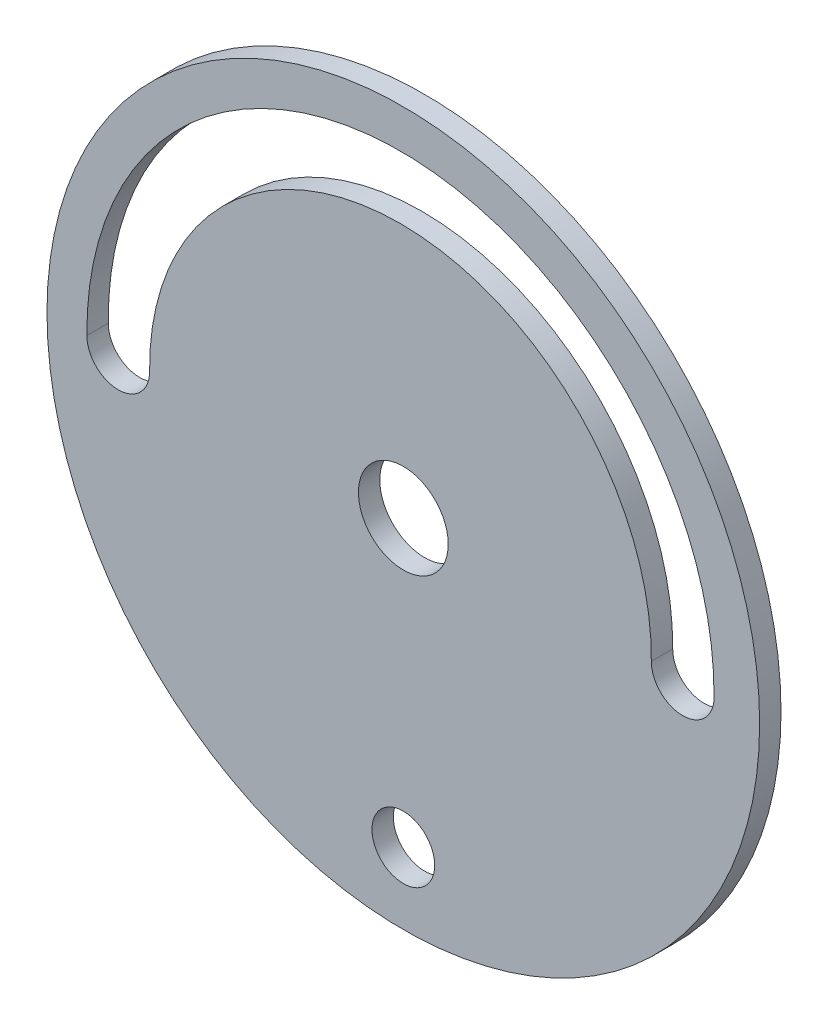
ISO-10303-21;
HEADER;
FILE_DESCRIPTION(('STEP AP214'),'2;1');
FILE_NAME('part.step','',(''),(''),'','','');
FILE_SCHEMA(('AUTOMOTIVE_DESIGN { 1 0 10303 214 1 1 1 1 }'));
ENDSEC;
DATA;
#1=APPLICATION_CONTEXT('core data for automotive mechanical design processes');
#2=APPLICATION_PROTOCOL_DEFINITION('international standard','automotive_design',2000,#1);
#3=PRODUCT_CONTEXT('',#1,'mechanical');
#4=PRODUCT('Part','Part','',(#3));
#5=PRODUCT_RELATED_PRODUCT_CATEGORY('part','',(#4));
#6=PRODUCT_DEFINITION_FORMATION('','',#4);
#7=PRODUCT_DEFINITION_CONTEXT('part definition',#1,'design');
#8=PRODUCT_DEFINITION('design','',#6,#7);
#9=PRODUCT_DEFINITION_SHAPE('','',#8);
#10=(LENGTH_UNIT() NAMED_UNIT(*) SI_UNIT(.MILLI.,.METRE.));
#11=(NAMED_UNIT(*) PLANE_ANGLE_UNIT() SI_UNIT($,.RADIAN.));
#12=(NAMED_UNIT(*) SI_UNIT($,.STERADIAN.) SOLID_ANGLE_UNIT());
#13=UNCERTAINTY_MEASURE_WITH_UNIT(LENGTH_MEASURE(1.E-05),#10,'distance_accuracy_value','');
#14=(GEOMETRIC_REPRESENTATION_CONTEXT(3) GLOBAL_UNCERTAINTY_ASSIGNED_CONTEXT((#13)) GLOBAL_UNIT_ASSIGNED_CONTEXT((#10,
#11,#12)) REPRESENTATION_CONTEXT('',''));
#15=CARTESIAN_POINT('',(0.,0.,0.));
#16=DIRECTION('',(0.,0.,1.));
#17=DIRECTION('',(1.,0.,0.));
#18=AXIS2_PLACEMENT_3D('',#15,#16,#17);
#19=CARTESIAN_POINT('',(-2.05647849595404,7.39481100918605,1.5));
#20=DIRECTION('',(0.,0.,1.));
#21=DIRECTION('',(1.,0.,0.));
#22=AXIS2_PLACEMENT_3D('',#19,#20,#21);
#23=PLANE('',#22);
#24=CARTESIAN_POINT('',(-2.25647849595403,7.59391010828515,1.5));
#25=DIRECTION('',(0.,0.,1.));
#26=DIRECTION('',(1.,0.,0.));
#27=AXIS2_PLACEMENT_3D('',#24,#25,#26);
#28=CIRCLE('',#27,22.0009009009009);
#29=CARTESIAN_POINT('',(19.743521504046,7.39481100918604,1.5));
#30=VERTEX_POINT('',#29);
#31=CARTESIAN_POINT('',(-24.256478495954,7.39481100918605,1.5));
#32=VERTEX_POINT('',#31);
#33=EDGE_CURVE('E96',#30,#32,#28,.T.);
#34=ORIENTED_EDGE('',*,*,#33,.F.);
#35=CARTESIAN_POINT('',(17.543521504046,7.39481100918605,1.5));
#36=DIRECTION('',(0.,0.,1.));
#37=DIRECTION('',(-1.,0.,0.));
#38=AXIS2_PLACEMENT_3D('',#35,#36,#37);
#39=CIRCLE('',#38,2.2);
#40=CARTESIAN_POINT('',(15.343521504046,7.39481100918605,1.5));
#41=VERTEX_POINT('',#40);
#42=EDGE_CURVE('E87',#41,#30,#39,.T.);
#43=ORIENTED_EDGE('',*,*,#42,.F.);
#44=CARTESIAN_POINT('',(-2.25647849595403,7.59368741368043,1.5));
#45=DIRECTION('',(0.,0.,-1.));
#46=DIRECTION('',(1.,0.,0.));
#47=AXIS2_PLACEMENT_3D('',#44,#45,#46);
#48=CIRCLE('',#47,17.6011235955056);
#49=CARTESIAN_POINT('',(-19.856478495954,7.39481100918605,1.5));
#50=VERTEX_POINT('',#49);
#51=EDGE_CURVE('E114',#50,#41,#48,.T.);
#52=ORIENTED_EDGE('',*,*,#51,.F.);
#53=CARTESIAN_POINT('',(-22.056478495954,7.39481100918605,1.5));
#54=DIRECTION('',(0.,0.,1.));
#55=DIRECTION('',(1.,0.,0.));
#56=AXIS2_PLACEMENT_3D('',#53,#54,#55);
#57=CIRCLE('',#56,2.2);
#58=EDGE_CURVE('E110',#32,#50,#57,.T.);
#59=ORIENTED_EDGE('',*,*,#58,.F.);
#60=EDGE_LOOP('',(#34,#43,#52,#59));
#61=FACE_BOUND('',#60,.T.);
#62=CARTESIAN_POINT('',(-2.05647849595404,-12.605188990814,1.5));
#63=DIRECTION('',(0.,0.,1.));
#64=DIRECTION('',(1.,0.,0.));
#65=AXIS2_PLACEMENT_3D('',#62,#63,#64);
#66=CIRCLE('',#65,2.2);
#67=CARTESIAN_POINT('',(0.143521504045963,-12.605188990814,1.5));
#68=VERTEX_POINT('',#67);
#69=EDGE_CURVE('E138',#68,#68,#66,.T.);
#70=ORIENTED_EDGE('',*,*,#69,.F.);
#71=EDGE_LOOP('',(#70));
#72=FACE_BOUND('',#71,.T.);
#73=CARTESIAN_POINT('',(-2.05647849595404,7.39481100918605,1.5));
#74=DIRECTION('',(0.,0.,1.));
#75=DIRECTION('',(1.,0.,0.));
#76=AXIS2_PLACEMENT_3D('',#73,#74,#75);
#77=CIRCLE('',#76,25.);
#78=CARTESIAN_POINT('',(22.943521504046,7.39481100918605,1.5));
#79=VERTEX_POINT('',#78);
#80=EDGE_CURVE('E11',#79,#79,#77,.T.);
#81=ORIENTED_EDGE('',*,*,#80,.T.);
#82=EDGE_LOOP('',(#81));
#83=FACE_BOUND('',#82,.T.);
#84=CARTESIAN_POINT('',(-2.05647849595404,7.39481100918605,1.5));
#85=DIRECTION('',(0.,0.,1.));
#86=DIRECTION('',(1.,0.,0.));
#87=AXIS2_PLACEMENT_3D('',#84,#85,#86);
#88=CIRCLE('',#87,3.15);
#89=CARTESIAN_POINT('',(1.09352150404596,7.39481100918605,1.5));
#90=VERTEX_POINT('',#89);
#91=EDGE_CURVE('E122',#90,#90,#88,.T.);
#92=ORIENTED_EDGE('',*,*,#91,.F.);
#93=EDGE_LOOP('',(#92));
#94=FACE_BOUND('',#93,.T.);
#95=ADVANCED_FACE('F45',(#61,#72,#83,#94),#23,.T.);
#96=CARTESIAN_POINT('',(-2.05647849595404,7.39481100918605,0.));
#97=DIRECTION('',(0.,0.,1.));
#98=DIRECTION('',(1.,0.,0.));
#99=AXIS2_PLACEMENT_3D('',#96,#97,#98);
#100=PLANE('',#99);
#101=CARTESIAN_POINT('',(-2.05647849595404,-12.605188990814,0.));
#102=DIRECTION('',(0.,0.,1.));
#103=DIRECTION('',(1.,0.,0.));
#104=AXIS2_PLACEMENT_3D('',#101,#102,#103);
#105=CIRCLE('',#104,2.2);
#106=CARTESIAN_POINT('',(0.143521504045963,-12.605188990814,0.));
#107=VERTEX_POINT('',#106);
#108=EDGE_CURVE('E105',#107,#107,#105,.T.);
#109=ORIENTED_EDGE('',*,*,#108,.T.);
#110=EDGE_LOOP('',(#109));
#111=FACE_BOUND('',#110,.T.);
#112=CARTESIAN_POINT('',(-2.05647849595404,7.39481100918605,0.));
#113=DIRECTION('',(0.,0.,1.));
#114=DIRECTION('',(1.,0.,0.));
#115=AXIS2_PLACEMENT_3D('',#112,#113,#114);
#116=CIRCLE('',#115,25.);
#117=CARTESIAN_POINT('',(22.943521504046,7.39481100918605,0.));
#118=VERTEX_POINT('',#117);
#119=EDGE_CURVE('E49',#118,#118,#116,.T.);
#120=ORIENTED_EDGE('',*,*,#119,.F.);
#121=EDGE_LOOP('',(#120));
#122=FACE_BOUND('',#121,.T.);
#123=CARTESIAN_POINT('',(17.543521504046,7.39481100918605,0.));
#124=DIRECTION('',(0.,0.,1.));
#125=DIRECTION('',(-1.,0.,0.));
#126=AXIS2_PLACEMENT_3D('',#123,#124,#125);
#127=CIRCLE('',#126,2.2);
#128=CARTESIAN_POINT('',(15.343521504046,7.39481100918605,0.));
#129=VERTEX_POINT('',#128);
#130=CARTESIAN_POINT('',(19.743521504046,7.39481100918604,0.));
#131=VERTEX_POINT('',#130);
#132=EDGE_CURVE('E69',#129,#131,#127,.T.);
#133=ORIENTED_EDGE('',*,*,#132,.T.);
#134=CARTESIAN_POINT('',(-2.25647849595403,7.59391010828515,0.));
#135=DIRECTION('',(0.,0.,1.));
#136=DIRECTION('',(1.,0.,0.));
#137=AXIS2_PLACEMENT_3D('',#134,#135,#136);
#138=CIRCLE('',#137,22.0009009009009);
#139=CARTESIAN_POINT('',(-24.256478495954,7.39481100918605,0.));
#140=VERTEX_POINT('',#139);
#141=EDGE_CURVE('E103',#131,#140,#138,.T.);
#142=ORIENTED_EDGE('',*,*,#141,.T.);
#143=CARTESIAN_POINT('',(-22.056478495954,7.39481100918605,0.));
#144=DIRECTION('',(0.,0.,1.));
#145=DIRECTION('',(1.,0.,0.));
#146=AXIS2_PLACEMENT_3D('',#143,#144,#145);
#147=CIRCLE('',#146,2.2);
#148=CARTESIAN_POINT('',(-19.856478495954,7.39481100918605,0.));
#149=VERTEX_POINT('',#148);
#150=EDGE_CURVE('E125',#140,#149,#147,.T.);
#151=ORIENTED_EDGE('',*,*,#150,.T.);
#152=CARTESIAN_POINT('',(-2.25647849595403,7.59368741368043,0.));
#153=DIRECTION('',(0.,0.,-1.));
#154=DIRECTION('',(1.,0.,0.));
#155=AXIS2_PLACEMENT_3D('',#152,#153,#154);
#156=CIRCLE('',#155,17.6011235955056);
#157=EDGE_CURVE('E97',#149,#129,#156,.T.);
#158=ORIENTED_EDGE('',*,*,#157,.T.);
#159=EDGE_LOOP('',(#133,#142,#151,#158));
#160=FACE_BOUND('',#159,.T.);
#161=CARTESIAN_POINT('',(-2.05647849595404,7.39481100918605,0.));
#162=DIRECTION('',(0.,0.,1.));
#163=DIRECTION('',(1.,0.,0.));
#164=AXIS2_PLACEMENT_3D('',#161,#162,#163);
#165=CIRCLE('',#164,3.15);
#166=CARTESIAN_POINT('',(1.09352150404596,7.39481100918605,0.));
#167=VERTEX_POINT('',#166);
#168=EDGE_CURVE('E227',#167,#167,#165,.T.);
#169=ORIENTED_EDGE('',*,*,#168,.T.);
#170=EDGE_LOOP('',(#169));
#171=FACE_BOUND('',#170,.T.);
#172=ADVANCED_FACE('F146',(#111,#122,#160,#171),#100,.F.);
#173=CARTESIAN_POINT('',(-2.05647849595404,7.39481100918605,1.5));
#174=DIRECTION('',(0.,0.,-1.));
#175=DIRECTION('',(-1.,0.,0.));
#176=AXIS2_PLACEMENT_3D('',#173,#174,#175);
#177=CYLINDRICAL_SURFACE('',#176,25.);
#178=ORIENTED_EDGE('',*,*,#80,.F.);
#179=EDGE_LOOP('',(#178));
#180=FACE_BOUND('',#179,.T.);
#181=ORIENTED_EDGE('',*,*,#119,.T.);
#182=EDGE_LOOP('',(#181));
#183=FACE_BOUND('',#182,.T.);
#184=ADVANCED_FACE('F47',(#180,#183),#177,.T.);
#185=CARTESIAN_POINT('',(-2.05647849595404,-12.605188990814,1.5));
#186=DIRECTION('',(0.,0.,-1.));
#187=DIRECTION('',(-1.,0.,0.));
#188=AXIS2_PLACEMENT_3D('',#185,#186,#187);
#189=CYLINDRICAL_SURFACE('',#188,2.2);
#190=ORIENTED_EDGE('',*,*,#69,.T.);
#191=EDGE_LOOP('',(#190));
#192=FACE_BOUND('',#191,.T.);
#193=ORIENTED_EDGE('',*,*,#108,.F.);
#194=EDGE_LOOP('',(#193));
#195=FACE_BOUND('',#194,.T.);
#196=ADVANCED_FACE('F149',(#192,#195),#189,.F.);
#197=CARTESIAN_POINT('',(17.543521504046,7.39481100918605,1.5));
#198=DIRECTION('',(0.,0.,-1.));
#199=DIRECTION('',(-1.,0.,0.));
#200=AXIS2_PLACEMENT_3D('',#197,#198,#199);
#201=CYLINDRICAL_SURFACE('',#200,2.2);
#202=ORIENTED_EDGE('',*,*,#132,.F.);
#203=DIRECTION('',(0.,0.,-1.));
#204=VECTOR('',#203,1.);
#205=CARTESIAN_POINT('',(15.343521504046,7.39481100918605,1.5));
#206=LINE('',#205,#204);
#207=EDGE_CURVE('E91',#41,#129,#206,.T.);
#208=ORIENTED_EDGE('',*,*,#207,.F.);
#209=ORIENTED_EDGE('',*,*,#42,.T.);
#210=DIRECTION('',(0.,0.,-1.));
#211=VECTOR('',#210,1.);
#212=CARTESIAN_POINT('',(19.743521504046,7.39481100918604,1.5));
#213=LINE('',#212,#211);
#214=EDGE_CURVE('E90',#30,#131,#213,.T.);
#215=ORIENTED_EDGE('',*,*,#214,.T.);
#216=EDGE_LOOP('',(#202,#208,#209,#215));
#217=FACE_BOUND('',#216,.T.);
#218=ADVANCED_FACE('F89',(#217),#201,.F.);
#219=CARTESIAN_POINT('',(-2.25647849595403,7.59391010828515,1.5));
#220=DIRECTION('',(0.,0.,-1.));
#221=DIRECTION('',(-1.,0.,0.));
#222=AXIS2_PLACEMENT_3D('',#219,#220,#221);
#223=CYLINDRICAL_SURFACE('',#222,22.0009009009009);
#224=ORIENTED_EDGE('',*,*,#141,.F.);
#225=ORIENTED_EDGE('',*,*,#214,.F.);
#226=ORIENTED_EDGE('',*,*,#33,.T.);
#227=DIRECTION('',(0.,0.,-1.));
#228=VECTOR('',#227,1.);
#229=CARTESIAN_POINT('',(-24.256478495954,7.39481100918605,1.5));
#230=LINE('',#229,#228);
#231=EDGE_CURVE('E106',#32,#140,#230,.T.);
#232=ORIENTED_EDGE('',*,*,#231,.T.);
#233=EDGE_LOOP('',(#224,#225,#226,#232));
#234=FACE_BOUND('',#233,.T.);
#235=ADVANCED_FACE('F100',(#234),#223,.F.);
#236=CARTESIAN_POINT('',(-22.056478495954,7.39481100918605,1.5));
#237=DIRECTION('',(0.,0.,-1.));
#238=DIRECTION('',(-1.,0.,0.));
#239=AXIS2_PLACEMENT_3D('',#236,#237,#238);
#240=CYLINDRICAL_SURFACE('',#239,2.2);
#241=ORIENTED_EDGE('',*,*,#150,.F.);
#242=ORIENTED_EDGE('',*,*,#231,.F.);
#243=ORIENTED_EDGE('',*,*,#58,.T.);
#244=DIRECTION('',(0.,0.,-1.));
#245=VECTOR('',#244,1.);
#246=CARTESIAN_POINT('',(-19.856478495954,7.39481100918605,1.5));
#247=LINE('',#246,#245);
#248=EDGE_CURVE('E61',#50,#149,#247,.T.);
#249=ORIENTED_EDGE('',*,*,#248,.T.);
#250=EDGE_LOOP('',(#241,#242,#243,#249));
#251=FACE_BOUND('',#250,.T.);
#252=ADVANCED_FACE('F191',(#251),#240,.F.);
#253=CARTESIAN_POINT('',(-2.25647849595403,7.59368741368043,1.5));
#254=DIRECTION('',(0.,0.,-1.));
#255=DIRECTION('',(-1.,0.,0.));
#256=AXIS2_PLACEMENT_3D('',#253,#254,#255);
#257=CYLINDRICAL_SURFACE('',#256,17.6011235955056);
#258=ORIENTED_EDGE('',*,*,#157,.F.);
#259=ORIENTED_EDGE('',*,*,#248,.F.);
#260=ORIENTED_EDGE('',*,*,#51,.T.);
#261=ORIENTED_EDGE('',*,*,#207,.T.);
#262=EDGE_LOOP('',(#258,#259,#260,#261));
#263=FACE_BOUND('',#262,.T.);
#264=ADVANCED_FACE('F200',(#263),#257,.T.);
#265=CARTESIAN_POINT('',(-2.05647849595404,7.39481100918605,1.5));
#266=DIRECTION('',(0.,0.,-1.));
#267=DIRECTION('',(-1.,0.,0.));
#268=AXIS2_PLACEMENT_3D('',#265,#266,#267);
#269=CYLINDRICAL_SURFACE('',#268,3.15);
#270=ORIENTED_EDGE('',*,*,#91,.T.);
#271=EDGE_LOOP('',(#270));
#272=FACE_BOUND('',#271,.T.);
#273=ORIENTED_EDGE('',*,*,#168,.F.);
#274=EDGE_LOOP('',(#273));
#275=FACE_BOUND('',#274,.T.);
#276=ADVANCED_FACE('F210',(#272,#275),#269,.F.);
#277=CLOSED_SHELL('',(#95,#172,#184,#196,#218,#235,#252,#264,#276));
#278=MANIFOLD_SOLID_BREP('B2',#277);
#279=ADVANCED_BREP_SHAPE_REPRESENTATION('',(#18,#278),#14);
#280=SHAPE_DEFINITION_REPRESENTATION(#9,#279);
ENDSEC;
END-ISO-10303-21;
